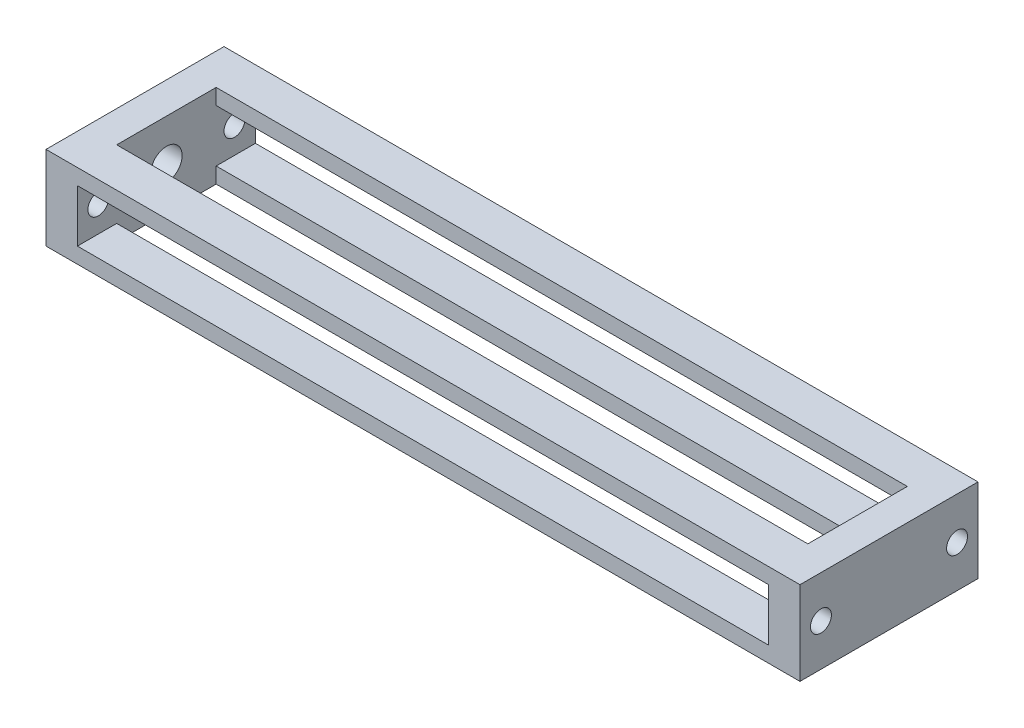
ISO-10303-21;
HEADER;
FILE_DESCRIPTION(('STEP AP214'),'2;1');
FILE_NAME('part.step','',(''),(''),'','','');
FILE_SCHEMA(('AUTOMOTIVE_DESIGN { 1 0 10303 214 1 1 1 1 }'));
ENDSEC;
DATA;
#1=APPLICATION_CONTEXT('core data for automotive mechanical design processes');
#2=APPLICATION_PROTOCOL_DEFINITION('international standard','automotive_design',2000,#1);
#3=PRODUCT_CONTEXT('',#1,'mechanical');
#4=PRODUCT('Part','Part','',(#3));
#5=PRODUCT_RELATED_PRODUCT_CATEGORY('part','',(#4));
#6=PRODUCT_DEFINITION_FORMATION('','',#4);
#7=PRODUCT_DEFINITION_CONTEXT('part definition',#1,'design');
#8=PRODUCT_DEFINITION('design','',#6,#7);
#9=PRODUCT_DEFINITION_SHAPE('','',#8);
#10=(LENGTH_UNIT() NAMED_UNIT(*) SI_UNIT(.MILLI.,.METRE.));
#11=(NAMED_UNIT(*) PLANE_ANGLE_UNIT() SI_UNIT($,.RADIAN.));
#12=(NAMED_UNIT(*) SI_UNIT($,.STERADIAN.) SOLID_ANGLE_UNIT());
#13=UNCERTAINTY_MEASURE_WITH_UNIT(LENGTH_MEASURE(1.E-05),#10,'distance_accuracy_value','');
#14=(GEOMETRIC_REPRESENTATION_CONTEXT(3) GLOBAL_UNCERTAINTY_ASSIGNED_CONTEXT((#13)) GLOBAL_UNIT_ASSIGNED_CONTEXT((#10,
#11,#12)) REPRESENTATION_CONTEXT('',''));
#15=CARTESIAN_POINT('',(0.,0.,0.));
#16=DIRECTION('',(0.,0.,1.));
#17=DIRECTION('',(1.,0.,0.));
#18=AXIS2_PLACEMENT_3D('',#15,#16,#17);
#19=CARTESIAN_POINT('',(-419.1,-0.001000000000001,60.325));
#20=DIRECTION('',(0.,0.,1.));
#21=DIRECTION('',(1.,0.,0.));
#22=AXIS2_PLACEMENT_3D('',#19,#20,#21);
#23=PLANE('',#22);
#24=DIRECTION('',(0.,1.,0.));
#25=VECTOR('',#24,1.);
#26=CARTESIAN_POINT('',(-419.1,-0.001000000000001,60.325));
#27=LINE('',#26,#25);
#28=CARTESIAN_POINT('',(-419.1,0.,60.325));
#29=VERTEX_POINT('',#28);
#30=CARTESIAN_POINT('',(-419.1,19.05,60.325));
#31=VERTEX_POINT('',#30);
#32=EDGE_CURVE('E262',#29,#31,#27,.T.);
#33=ORIENTED_EDGE('',*,*,#32,.T.);
#34=DIRECTION('',(1.,0.,0.));
#35=VECTOR('',#34,1.);
#36=CARTESIAN_POINT('',(-419.1,19.05,60.325));
#37=LINE('',#36,#35);
#38=CARTESIAN_POINT('',(419.1,19.05,60.325));
#39=VERTEX_POINT('',#38);
#40=EDGE_CURVE('E218',#31,#39,#37,.T.);
#41=ORIENTED_EDGE('',*,*,#40,.T.);
#42=DIRECTION('',(0.,1.,0.));
#43=VECTOR('',#42,1.);
#44=CARTESIAN_POINT('',(419.1,-0.001000000000001,60.325));
#45=LINE('',#44,#43);
#46=CARTESIAN_POINT('',(419.1,0.,60.325));
#47=VERTEX_POINT('',#46);
#48=EDGE_CURVE('E256',#47,#39,#45,.T.);
#49=ORIENTED_EDGE('',*,*,#48,.F.);
#50=DIRECTION('',(-1.,0.,0.));
#51=VECTOR('',#50,1.);
#52=CARTESIAN_POINT('',(-419.1,0.,60.325));
#53=LINE('',#52,#51);
#54=EDGE_CURVE('E233',#47,#29,#53,.T.);
#55=ORIENTED_EDGE('',*,*,#54,.T.);
#56=EDGE_LOOP('',(#33,#41,#49,#55));
#57=FACE_BOUND('',#56,.T.);
#58=ADVANCED_FACE('F42',(#57),#23,.F.);
#59=CARTESIAN_POINT('',(-419.1,-0.001000000000001,-60.325));
#60=DIRECTION('',(0.,0.,-1.));
#61=DIRECTION('',(-1.,0.,0.));
#62=AXIS2_PLACEMENT_3D('',#59,#60,#61);
#63=PLANE('',#62);
#64=DIRECTION('',(0.,1.,0.));
#65=VECTOR('',#64,1.);
#66=CARTESIAN_POINT('',(419.1,-0.001000000000001,-60.325));
#67=LINE('',#66,#65);
#68=CARTESIAN_POINT('',(419.1,0.,-60.325));
#69=VERTEX_POINT('',#68);
#70=CARTESIAN_POINT('',(419.1,19.05,-60.325));
#71=VERTEX_POINT('',#70);
#72=EDGE_CURVE('E272',#69,#71,#67,.T.);
#73=ORIENTED_EDGE('',*,*,#72,.T.);
#74=DIRECTION('',(-1.,0.,0.));
#75=VECTOR('',#74,1.);
#76=CARTESIAN_POINT('',(-419.1,19.05,-60.325));
#77=LINE('',#76,#75);
#78=CARTESIAN_POINT('',(-419.1,19.05,-60.325));
#79=VERTEX_POINT('',#78);
#80=EDGE_CURVE('E11',#71,#79,#77,.T.);
#81=ORIENTED_EDGE('',*,*,#80,.T.);
#82=DIRECTION('',(0.,1.,0.));
#83=VECTOR('',#82,1.);
#84=CARTESIAN_POINT('',(-419.1,-0.001000000000001,-60.325));
#85=LINE('',#84,#83);
#86=CARTESIAN_POINT('',(-419.1,0.,-60.325));
#87=VERTEX_POINT('',#86);
#88=EDGE_CURVE('E267',#87,#79,#85,.T.);
#89=ORIENTED_EDGE('',*,*,#88,.F.);
#90=DIRECTION('',(1.,0.,0.));
#91=VECTOR('',#90,1.);
#92=CARTESIAN_POINT('',(-419.1,0.,-60.325));
#93=LINE('',#92,#91);
#94=EDGE_CURVE('E260',#87,#69,#93,.T.);
#95=ORIENTED_EDGE('',*,*,#94,.T.);
#96=EDGE_LOOP('',(#73,#81,#89,#95));
#97=FACE_BOUND('',#96,.T.);
#98=ADVANCED_FACE('F401',(#97),#63,.F.);
#99=CARTESIAN_POINT('',(457.2,101.6,-107.95));
#100=DIRECTION('',(-1.,0.,0.));
#101=DIRECTION('',(0.,0.,1.));
#102=AXIS2_PLACEMENT_3D('',#99,#100,#101);
#103=PLANE('',#102);
#104=CARTESIAN_POINT('',(457.2,50.8,82.5499999999996));
#105=DIRECTION('',(-1.,0.,0.));
#106=DIRECTION('',(0.,0.,1.));
#107=AXIS2_PLACEMENT_3D('',#104,#105,#106);
#108=CIRCLE('',#107,12.7);
#109=CARTESIAN_POINT('',(457.2,50.8,95.2499999999996));
#110=VERTEX_POINT('',#109);
#111=EDGE_CURVE('E326',#110,#110,#108,.T.);
#112=ORIENTED_EDGE('',*,*,#111,.T.);
#113=EDGE_LOOP('',(#112));
#114=FACE_BOUND('',#113,.T.);
#115=CARTESIAN_POINT('',(457.2,50.8,-82.5500000000004));
#116=DIRECTION('',(-1.,0.,0.));
#117=DIRECTION('',(0.,0.,1.));
#118=AXIS2_PLACEMENT_3D('',#115,#116,#117);
#119=CIRCLE('',#118,12.7);
#120=CARTESIAN_POINT('',(457.2,50.8,-69.8500000000004));
#121=VERTEX_POINT('',#120);
#122=EDGE_CURVE('E348',#121,#121,#119,.T.);
#123=ORIENTED_EDGE('',*,*,#122,.T.);
#124=EDGE_LOOP('',(#123));
#125=FACE_BOUND('',#124,.T.);
#126=DIRECTION('',(0.,0.,-1.));
#127=VECTOR('',#126,1.);
#128=CARTESIAN_POINT('',(457.2,0.,-107.95));
#129=LINE('',#128,#127);
#130=CARTESIAN_POINT('',(457.2,0.,107.95));
#131=VERTEX_POINT('',#130);
#132=CARTESIAN_POINT('',(457.2,0.,-107.95));
#133=VERTEX_POINT('',#132);
#134=EDGE_CURVE('E279',#131,#133,#129,.T.);
#135=ORIENTED_EDGE('',*,*,#134,.T.);
#136=DIRECTION('',(0.,-1.,0.));
#137=VECTOR('',#136,1.);
#138=CARTESIAN_POINT('',(457.2,101.6,-107.95));
#139=LINE('',#138,#137);
#140=CARTESIAN_POINT('',(457.2,101.6,-107.95));
#141=VERTEX_POINT('',#140);
#142=EDGE_CURVE('E317',#141,#133,#139,.T.);
#143=ORIENTED_EDGE('',*,*,#142,.F.);
#144=DIRECTION('',(0.,0.,-1.));
#145=VECTOR('',#144,1.);
#146=CARTESIAN_POINT('',(457.2,101.6,-107.95));
#147=LINE('',#146,#145);
#148=CARTESIAN_POINT('',(457.2,101.6,107.95));
#149=VERTEX_POINT('',#148);
#150=EDGE_CURVE('E280',#149,#141,#147,.T.);
#151=ORIENTED_EDGE('',*,*,#150,.F.);
#152=DIRECTION('',(0.,-1.,0.));
#153=VECTOR('',#152,1.);
#154=CARTESIAN_POINT('',(457.2,101.6,107.95));
#155=LINE('',#154,#153);
#156=EDGE_CURVE('E294',#149,#131,#155,.T.);
#157=ORIENTED_EDGE('',*,*,#156,.T.);
#158=EDGE_LOOP('',(#135,#143,#151,#157));
#159=FACE_BOUND('',#158,.T.);
#160=ADVANCED_FACE('F44',(#114,#125,#159),#103,.F.);
#161=CARTESIAN_POINT('',(-457.2,101.6,-107.95));
#162=DIRECTION('',(0.,0.,1.));
#163=DIRECTION('',(1.,0.,0.));
#164=AXIS2_PLACEMENT_3D('',#161,#162,#163);
#165=PLANE('',#164);
#166=DIRECTION('',(1.,0.,0.));
#167=VECTOR('',#166,1.);
#168=CARTESIAN_POINT('',(-419.1,19.05,-107.95));
#169=LINE('',#168,#167);
#170=CARTESIAN_POINT('',(-419.1,19.05,-107.95));
#171=VERTEX_POINT('',#170);
#172=CARTESIAN_POINT('',(419.1,19.05,-107.95));
#173=VERTEX_POINT('',#172);
#174=EDGE_CURVE('E183',#171,#173,#169,.T.);
#175=ORIENTED_EDGE('',*,*,#174,.T.);
#176=DIRECTION('',(0.,1.,0.));
#177=VECTOR('',#176,1.);
#178=CARTESIAN_POINT('',(419.1,82.55,-107.95));
#179=LINE('',#178,#177);
#180=CARTESIAN_POINT('',(419.1,82.55,-107.95));
#181=VERTEX_POINT('',#180);
#182=EDGE_CURVE('E164',#173,#181,#179,.T.);
#183=ORIENTED_EDGE('',*,*,#182,.T.);
#184=DIRECTION('',(-1.,0.,0.));
#185=VECTOR('',#184,1.);
#186=CARTESIAN_POINT('',(-419.1,82.55,-107.95));
#187=LINE('',#186,#185);
#188=CARTESIAN_POINT('',(-419.1,82.55,-107.95));
#189=VERTEX_POINT('',#188);
#190=EDGE_CURVE('E174',#181,#189,#187,.T.);
#191=ORIENTED_EDGE('',*,*,#190,.T.);
#192=DIRECTION('',(0.,-1.,0.));
#193=VECTOR('',#192,1.);
#194=CARTESIAN_POINT('',(-419.1,82.55,-107.95));
#195=LINE('',#194,#193);
#196=EDGE_CURVE('E60',#189,#171,#195,.T.);
#197=ORIENTED_EDGE('',*,*,#196,.T.);
#198=EDGE_LOOP('',(#175,#183,#191,#197));
#199=FACE_BOUND('',#198,.T.);
#200=DIRECTION('',(-1.,0.,0.));
#201=VECTOR('',#200,1.);
#202=CARTESIAN_POINT('',(-457.2,0.,-107.95));
#203=LINE('',#202,#201);
#204=CARTESIAN_POINT('',(-457.2,0.,-107.95));
#205=VERTEX_POINT('',#204);
#206=EDGE_CURVE('E298',#133,#205,#203,.T.);
#207=ORIENTED_EDGE('',*,*,#206,.T.);
#208=DIRECTION('',(0.,-1.,0.));
#209=VECTOR('',#208,1.);
#210=CARTESIAN_POINT('',(-457.2,101.6,-107.95));
#211=LINE('',#210,#209);
#212=CARTESIAN_POINT('',(-457.2,101.6,-107.95));
#213=VERTEX_POINT('',#212);
#214=EDGE_CURVE('E313',#213,#205,#211,.T.);
#215=ORIENTED_EDGE('',*,*,#214,.F.);
#216=DIRECTION('',(-1.,0.,0.));
#217=VECTOR('',#216,1.);
#218=CARTESIAN_POINT('',(-457.2,101.6,-107.95));
#219=LINE('',#218,#217);
#220=EDGE_CURVE('E284',#141,#213,#219,.T.);
#221=ORIENTED_EDGE('',*,*,#220,.F.);
#222=ORIENTED_EDGE('',*,*,#142,.T.);
#223=EDGE_LOOP('',(#207,#215,#221,#222));
#224=FACE_BOUND('',#223,.T.);
#225=ADVANCED_FACE('F180',(#199,#224),#165,.F.);
#226=CARTESIAN_POINT('',(-457.2,101.6,-107.95));
#227=DIRECTION('',(1.,0.,0.));
#228=DIRECTION('',(0.,0.,-1.));
#229=AXIS2_PLACEMENT_3D('',#226,#227,#228);
#230=PLANE('',#229);
#231=CARTESIAN_POINT('',(-457.2,50.8,2.35106052273563E-13));
#232=DIRECTION('',(-1.,0.,0.));
#233=DIRECTION('',(0.,0.,1.));
#234=AXIS2_PLACEMENT_3D('',#231,#232,#233);
#235=CIRCLE('',#234,19.05);
#236=CARTESIAN_POINT('',(-457.2,50.8,19.0500000000002));
#237=VERTEX_POINT('',#236);
#238=EDGE_CURVE('E342',#237,#237,#235,.T.);
#239=ORIENTED_EDGE('',*,*,#238,.F.);
#240=EDGE_LOOP('',(#239));
#241=FACE_BOUND('',#240,.T.);
#242=CARTESIAN_POINT('',(-457.2,50.8,82.55));
#243=DIRECTION('',(-1.,0.,0.));
#244=DIRECTION('',(0.,0.,1.));
#245=AXIS2_PLACEMENT_3D('',#242,#243,#244);
#246=CIRCLE('',#245,12.7);
#247=CARTESIAN_POINT('',(-457.2,50.8,95.25));
#248=VERTEX_POINT('',#247);
#249=EDGE_CURVE('E333',#248,#248,#246,.T.);
#250=ORIENTED_EDGE('',*,*,#249,.F.);
#251=EDGE_LOOP('',(#250));
#252=FACE_BOUND('',#251,.T.);
#253=CARTESIAN_POINT('',(-457.2,50.8,-82.55));
#254=DIRECTION('',(-1.,0.,0.));
#255=DIRECTION('',(0.,0.,1.));
#256=AXIS2_PLACEMENT_3D('',#253,#254,#255);
#257=CIRCLE('',#256,12.7);
#258=CARTESIAN_POINT('',(-457.2,50.8,-69.85));
#259=VERTEX_POINT('',#258);
#260=EDGE_CURVE('E339',#259,#259,#257,.T.);
#261=ORIENTED_EDGE('',*,*,#260,.F.);
#262=EDGE_LOOP('',(#261));
#263=FACE_BOUND('',#262,.T.);
#264=DIRECTION('',(0.,0.,1.));
#265=VECTOR('',#264,1.);
#266=CARTESIAN_POINT('',(-457.2,0.,-107.95));
#267=LINE('',#266,#265);
#268=CARTESIAN_POINT('',(-457.2,0.,107.95));
#269=VERTEX_POINT('',#268);
#270=EDGE_CURVE('E301',#205,#269,#267,.T.);
#271=ORIENTED_EDGE('',*,*,#270,.T.);
#272=DIRECTION('',(0.,-1.,0.));
#273=VECTOR('',#272,1.);
#274=CARTESIAN_POINT('',(-457.2,101.6,107.95));
#275=LINE('',#274,#273);
#276=CARTESIAN_POINT('',(-457.2,101.6,107.95));
#277=VERTEX_POINT('',#276);
#278=EDGE_CURVE('E309',#277,#269,#275,.T.);
#279=ORIENTED_EDGE('',*,*,#278,.F.);
#280=DIRECTION('',(0.,0.,1.));
#281=VECTOR('',#280,1.);
#282=CARTESIAN_POINT('',(-457.2,101.6,-107.95));
#283=LINE('',#282,#281);
#284=EDGE_CURVE('E288',#213,#277,#283,.T.);
#285=ORIENTED_EDGE('',*,*,#284,.F.);
#286=ORIENTED_EDGE('',*,*,#214,.T.);
#287=EDGE_LOOP('',(#271,#279,#285,#286));
#288=FACE_BOUND('',#287,.T.);
#289=ADVANCED_FACE('F446',(#241,#252,#263,#288),#230,.F.);
#290=CARTESIAN_POINT('',(-457.2,101.6,107.95));
#291=DIRECTION('',(0.,0.,-1.));
#292=DIRECTION('',(-1.,0.,0.));
#293=AXIS2_PLACEMENT_3D('',#290,#291,#292);
#294=PLANE('',#293);
#295=DIRECTION('',(1.,0.,0.));
#296=VECTOR('',#295,1.);
#297=CARTESIAN_POINT('',(-457.2,82.55,107.95));
#298=LINE('',#297,#296);
#299=CARTESIAN_POINT('',(-419.1,82.55,107.95));
#300=VERTEX_POINT('',#299);
#301=CARTESIAN_POINT('',(419.1,82.55,107.95));
#302=VERTEX_POINT('',#301);
#303=EDGE_CURVE('E210',#300,#302,#298,.T.);
#304=ORIENTED_EDGE('',*,*,#303,.T.);
#305=DIRECTION('',(0.,-1.,0.));
#306=VECTOR('',#305,1.);
#307=CARTESIAN_POINT('',(419.1,101.6,107.95));
#308=LINE('',#307,#306);
#309=CARTESIAN_POINT('',(419.1,19.05,107.95));
#310=VERTEX_POINT('',#309);
#311=EDGE_CURVE('E226',#302,#310,#308,.T.);
#312=ORIENTED_EDGE('',*,*,#311,.T.);
#313=DIRECTION('',(-1.,0.,0.));
#314=VECTOR('',#313,1.);
#315=CARTESIAN_POINT('',(-457.2,19.05,107.95));
#316=LINE('',#315,#314);
#317=CARTESIAN_POINT('',(-419.1,19.05,107.95));
#318=VERTEX_POINT('',#317);
#319=EDGE_CURVE('E222',#310,#318,#316,.T.);
#320=ORIENTED_EDGE('',*,*,#319,.T.);
#321=DIRECTION('',(0.,1.,0.));
#322=VECTOR('',#321,1.);
#323=CARTESIAN_POINT('',(-419.1,101.6,107.95));
#324=LINE('',#323,#322);
#325=EDGE_CURVE('E214',#318,#300,#324,.T.);
#326=ORIENTED_EDGE('',*,*,#325,.T.);
#327=EDGE_LOOP('',(#304,#312,#320,#326));
#328=FACE_BOUND('',#327,.T.);
#329=DIRECTION('',(1.,0.,0.));
#330=VECTOR('',#329,1.);
#331=CARTESIAN_POINT('',(-457.2,0.,107.95));
#332=LINE('',#331,#330);
#333=EDGE_CURVE('E285',#269,#131,#332,.T.);
#334=ORIENTED_EDGE('',*,*,#333,.T.);
#335=ORIENTED_EDGE('',*,*,#156,.F.);
#336=DIRECTION('',(1.,0.,0.));
#337=VECTOR('',#336,1.);
#338=CARTESIAN_POINT('',(-457.2,101.6,107.95));
#339=LINE('',#338,#337);
#340=EDGE_CURVE('E291',#277,#149,#339,.T.);
#341=ORIENTED_EDGE('',*,*,#340,.F.);
#342=ORIENTED_EDGE('',*,*,#278,.T.);
#343=EDGE_LOOP('',(#334,#335,#341,#342));
#344=FACE_BOUND('',#343,.T.);
#345=ADVANCED_FACE('F391',(#328,#344),#294,.F.);
#346=CARTESIAN_POINT('',(0.,101.6,0.));
#347=DIRECTION('',(0.,1.,0.));
#348=DIRECTION('',(0.,0.,1.));
#349=AXIS2_PLACEMENT_3D('',#346,#347,#348);
#350=PLANE('',#349);
#351=DIRECTION('',(0.,0.,-1.));
#352=VECTOR('',#351,1.);
#353=CARTESIAN_POINT('',(419.1,101.6,-60.325));
#354=LINE('',#353,#352);
#355=CARTESIAN_POINT('',(419.1,101.6,60.325));
#356=VERTEX_POINT('',#355);
#357=CARTESIAN_POINT('',(419.1,101.6,-60.325));
#358=VERTEX_POINT('',#357);
#359=EDGE_CURVE('E241',#356,#358,#354,.T.);
#360=ORIENTED_EDGE('',*,*,#359,.F.);
#361=DIRECTION('',(1.,0.,0.));
#362=VECTOR('',#361,1.);
#363=CARTESIAN_POINT('',(-419.1,101.6,60.325));
#364=LINE('',#363,#362);
#365=CARTESIAN_POINT('',(-419.1,101.6,60.325));
#366=VERTEX_POINT('',#365);
#367=EDGE_CURVE('E252',#366,#356,#364,.T.);
#368=ORIENTED_EDGE('',*,*,#367,.F.);
#369=DIRECTION('',(0.,0.,1.));
#370=VECTOR('',#369,1.);
#371=CARTESIAN_POINT('',(-419.1,101.6,-60.325));
#372=LINE('',#371,#370);
#373=CARTESIAN_POINT('',(-419.1,101.6,-60.325));
#374=VERTEX_POINT('',#373);
#375=EDGE_CURVE('E248',#374,#366,#372,.T.);
#376=ORIENTED_EDGE('',*,*,#375,.F.);
#377=DIRECTION('',(-1.,0.,0.));
#378=VECTOR('',#377,1.);
#379=CARTESIAN_POINT('',(-419.1,101.6,-60.325));
#380=LINE('',#379,#378);
#381=EDGE_CURVE('E244',#358,#374,#380,.T.);
#382=ORIENTED_EDGE('',*,*,#381,.F.);
#383=EDGE_LOOP('',(#360,#368,#376,#382));
#384=FACE_BOUND('',#383,.T.);
#385=ORIENTED_EDGE('',*,*,#150,.T.);
#386=ORIENTED_EDGE('',*,*,#220,.T.);
#387=ORIENTED_EDGE('',*,*,#284,.T.);
#388=ORIENTED_EDGE('',*,*,#340,.T.);
#389=EDGE_LOOP('',(#385,#386,#387,#388));
#390=FACE_BOUND('',#389,.T.);
#391=ADVANCED_FACE('F432',(#384,#390),#350,.T.);
#392=CARTESIAN_POINT('',(0.,0.,0.));
#393=DIRECTION('',(0.,1.,0.));
#394=DIRECTION('',(0.,0.,1.));
#395=AXIS2_PLACEMENT_3D('',#392,#393,#394);
#396=PLANE('',#395);
#397=ORIENTED_EDGE('',*,*,#54,.F.);
#398=DIRECTION('',(0.,0.,1.));
#399=VECTOR('',#398,1.);
#400=CARTESIAN_POINT('',(419.1,0.,-60.325));
#401=LINE('',#400,#399);
#402=EDGE_CURVE('E237',#69,#47,#401,.T.);
#403=ORIENTED_EDGE('',*,*,#402,.F.);
#404=ORIENTED_EDGE('',*,*,#94,.F.);
#405=DIRECTION('',(0.,0.,-1.));
#406=VECTOR('',#405,1.);
#407=CARTESIAN_POINT('',(-419.1,0.,-60.325));
#408=LINE('',#407,#406);
#409=EDGE_CURVE('E230',#29,#87,#408,.T.);
#410=ORIENTED_EDGE('',*,*,#409,.F.);
#411=EDGE_LOOP('',(#397,#403,#404,#410));
#412=FACE_BOUND('',#411,.T.);
#413=ORIENTED_EDGE('',*,*,#134,.F.);
#414=ORIENTED_EDGE('',*,*,#333,.F.);
#415=ORIENTED_EDGE('',*,*,#270,.F.);
#416=ORIENTED_EDGE('',*,*,#206,.F.);
#417=EDGE_LOOP('',(#413,#414,#415,#416));
#418=FACE_BOUND('',#417,.T.);
#419=ADVANCED_FACE('F403',(#412,#418),#396,.F.);
#420=CARTESIAN_POINT('',(419.1,-0.001000000000001,-60.325));
#421=DIRECTION('',(1.,0.,0.));
#422=DIRECTION('',(0.,0.,-1.));
#423=AXIS2_PLACEMENT_3D('',#420,#421,#422);
#424=PLANE('',#423);
#425=CARTESIAN_POINT('',(419.1,50.8,82.5499999999996));
#426=DIRECTION('',(1.,0.,0.));
#427=DIRECTION('',(0.,0.,-1.));
#428=AXIS2_PLACEMENT_3D('',#425,#426,#427);
#429=CIRCLE('',#428,12.7);
#430=CARTESIAN_POINT('',(419.1,50.8,69.8499999999996));
#431=VERTEX_POINT('',#430);
#432=EDGE_CURVE('E185',#431,#431,#429,.T.);
#433=ORIENTED_EDGE('',*,*,#432,.T.);
#434=EDGE_LOOP('',(#433));
#435=FACE_BOUND('',#434,.T.);
#436=CARTESIAN_POINT('',(419.1,50.8,-82.5500000000004));
#437=DIRECTION('',(1.,0.,0.));
#438=DIRECTION('',(0.,0.,-1.));
#439=AXIS2_PLACEMENT_3D('',#436,#437,#438);
#440=CIRCLE('',#439,12.7);
#441=CARTESIAN_POINT('',(419.1,50.8,-95.2500000000004));
#442=VERTEX_POINT('',#441);
#443=EDGE_CURVE('E325',#442,#442,#440,.T.);
#444=ORIENTED_EDGE('',*,*,#443,.T.);
#445=EDGE_LOOP('',(#444));
#446=FACE_BOUND('',#445,.T.);
#447=CARTESIAN_POINT('',(419.1,82.55,-60.325));
#448=VERTEX_POINT('',#447);
#449=EDGE_CURVE('E167',#448,#358,#67,.T.);
#450=ORIENTED_EDGE('',*,*,#449,.F.);
#451=DIRECTION('',(0.,0.,1.));
#452=VECTOR('',#451,1.);
#453=CARTESIAN_POINT('',(419.1,82.55,-107.95));
#454=LINE('',#453,#452);
#455=EDGE_CURVE('E159',#181,#448,#454,.T.);
#456=ORIENTED_EDGE('',*,*,#455,.F.);
#457=ORIENTED_EDGE('',*,*,#182,.F.);
#458=DIRECTION('',(0.,0.,1.));
#459=VECTOR('',#458,1.);
#460=CARTESIAN_POINT('',(419.1,19.05,-107.95));
#461=LINE('',#460,#459);
#462=EDGE_CURVE('E196',#173,#71,#461,.T.);
#463=ORIENTED_EDGE('',*,*,#462,.T.);
#464=ORIENTED_EDGE('',*,*,#72,.F.);
#465=ORIENTED_EDGE('',*,*,#402,.T.);
#466=ORIENTED_EDGE('',*,*,#48,.T.);
#467=EDGE_CURVE('E200',#39,#310,#461,.T.);
#468=ORIENTED_EDGE('',*,*,#467,.T.);
#469=ORIENTED_EDGE('',*,*,#311,.F.);
#470=CARTESIAN_POINT('',(419.1,82.55,60.325));
#471=VERTEX_POINT('',#470);
#472=EDGE_CURVE('E68',#471,#302,#454,.T.);
#473=ORIENTED_EDGE('',*,*,#472,.F.);
#474=EDGE_CURVE('E261',#471,#356,#45,.T.);
#475=ORIENTED_EDGE('',*,*,#474,.T.);
#476=ORIENTED_EDGE('',*,*,#359,.T.);
#477=EDGE_LOOP('',(#450,#456,#457,#463,#464,#465,#466,#468,#469,#473,#475,#476));
#478=FACE_BOUND('',#477,.T.);
#479=ADVANCED_FACE('F161',(#435,#446,#478),#424,.F.);
#480=ORIENTED_EDGE('',*,*,#474,.F.);
#481=DIRECTION('',(-1.,0.,0.));
#482=VECTOR('',#481,1.);
#483=CARTESIAN_POINT('',(-419.1,82.55,60.325));
#484=LINE('',#483,#482);
#485=CARTESIAN_POINT('',(-419.1,82.55,60.325));
#486=VERTEX_POINT('',#485);
#487=EDGE_CURVE('E199',#471,#486,#484,.T.);
#488=ORIENTED_EDGE('',*,*,#487,.T.);
#489=EDGE_CURVE('E266',#486,#366,#27,.T.);
#490=ORIENTED_EDGE('',*,*,#489,.T.);
#491=ORIENTED_EDGE('',*,*,#367,.T.);
#492=EDGE_LOOP('',(#480,#488,#490,#491));
#493=FACE_BOUND('',#492,.T.);
#494=ADVANCED_FACE('F368',(#493),#23,.F.);
#495=CARTESIAN_POINT('',(-419.1,-0.001000000000001,-60.325));
#496=DIRECTION('',(-1.,0.,0.));
#497=DIRECTION('',(0.,0.,1.));
#498=AXIS2_PLACEMENT_3D('',#495,#496,#497);
#499=PLANE('',#498);
#500=CARTESIAN_POINT('',(-419.1,50.8,2.15513881250766E-13));
#501=DIRECTION('',(-1.,0.,0.));
#502=DIRECTION('',(0.,0.,1.));
#503=AXIS2_PLACEMENT_3D('',#500,#501,#502);
#504=CIRCLE('',#503,19.05);
#505=CARTESIAN_POINT('',(-419.1,50.8,19.0500000000002));
#506=VERTEX_POINT('',#505);
#507=EDGE_CURVE('E355',#506,#506,#504,.F.);
#508=ORIENTED_EDGE('',*,*,#507,.F.);
#509=EDGE_LOOP('',(#508));
#510=FACE_BOUND('',#509,.T.);
#511=CARTESIAN_POINT('',(-419.1,50.8,82.55));
#512=DIRECTION('',(-1.,0.,0.));
#513=DIRECTION('',(0.,0.,1.));
#514=AXIS2_PLACEMENT_3D('',#511,#512,#513);
#515=CIRCLE('',#514,12.7);
#516=CARTESIAN_POINT('',(-419.1,50.8,95.25));
#517=VERTEX_POINT('',#516);
#518=EDGE_CURVE('E46',#517,#517,#515,.T.);
#519=ORIENTED_EDGE('',*,*,#518,.T.);
#520=EDGE_LOOP('',(#519));
#521=FACE_BOUND('',#520,.T.);
#522=CARTESIAN_POINT('',(-419.1,50.8,-82.55));
#523=DIRECTION('',(-1.,0.,0.));
#524=DIRECTION('',(0.,0.,1.));
#525=AXIS2_PLACEMENT_3D('',#522,#523,#524);
#526=CIRCLE('',#525,12.7);
#527=CARTESIAN_POINT('',(-419.1,50.8,-69.85));
#528=VERTEX_POINT('',#527);
#529=EDGE_CURVE('E322',#528,#528,#526,.T.);
#530=ORIENTED_EDGE('',*,*,#529,.T.);
#531=EDGE_LOOP('',(#530));
#532=FACE_BOUND('',#531,.T.);
#533=ORIENTED_EDGE('',*,*,#489,.F.);
#534=DIRECTION('',(0.,0.,1.));
#535=VECTOR('',#534,1.);
#536=CARTESIAN_POINT('',(-419.1,82.55,-107.95));
#537=LINE('',#536,#535);
#538=EDGE_CURVE('E171',#486,#300,#537,.T.);
#539=ORIENTED_EDGE('',*,*,#538,.T.);
#540=ORIENTED_EDGE('',*,*,#325,.F.);
#541=DIRECTION('',(0.,0.,1.));
#542=VECTOR('',#541,1.);
#543=CARTESIAN_POINT('',(-419.1,19.05,-107.95));
#544=LINE('',#543,#542);
#545=EDGE_CURVE('E204',#31,#318,#544,.T.);
#546=ORIENTED_EDGE('',*,*,#545,.F.);
#547=ORIENTED_EDGE('',*,*,#32,.F.);
#548=ORIENTED_EDGE('',*,*,#409,.T.);
#549=ORIENTED_EDGE('',*,*,#88,.T.);
#550=EDGE_CURVE('E201',#171,#79,#544,.T.);
#551=ORIENTED_EDGE('',*,*,#550,.F.);
#552=ORIENTED_EDGE('',*,*,#196,.F.);
#553=CARTESIAN_POINT('',(-419.1,82.55,-60.325));
#554=VERTEX_POINT('',#553);
#555=EDGE_CURVE('E176',#189,#554,#537,.T.);
#556=ORIENTED_EDGE('',*,*,#555,.T.);
#557=EDGE_CURVE('E271',#554,#374,#85,.T.);
#558=ORIENTED_EDGE('',*,*,#557,.T.);
#559=ORIENTED_EDGE('',*,*,#375,.T.);
#560=EDGE_LOOP('',(#533,#539,#540,#546,#547,#548,#549,#551,#552,#556,#558,#559));
#561=FACE_BOUND('',#560,.T.);
#562=ADVANCED_FACE('F364',(#510,#521,#532,#561),#499,.F.);
#563=ORIENTED_EDGE('',*,*,#557,.F.);
#564=DIRECTION('',(1.,0.,0.));
#565=VECTOR('',#564,1.);
#566=CARTESIAN_POINT('',(-419.1,82.55,-60.325));
#567=LINE('',#566,#565);
#568=EDGE_CURVE('E52',#554,#448,#567,.T.);
#569=ORIENTED_EDGE('',*,*,#568,.T.);
#570=ORIENTED_EDGE('',*,*,#449,.T.);
#571=ORIENTED_EDGE('',*,*,#381,.T.);
#572=EDGE_LOOP('',(#563,#569,#570,#571));
#573=FACE_BOUND('',#572,.T.);
#574=ADVANCED_FACE('F367',(#573),#63,.F.);
#575=CARTESIAN_POINT('',(-419.1,82.55,-107.95));
#576=DIRECTION('',(0.,1.,0.));
#577=DIRECTION('',(0.,0.,1.));
#578=AXIS2_PLACEMENT_3D('',#575,#576,#577);
#579=PLANE('',#578);
#580=ORIENTED_EDGE('',*,*,#555,.F.);
#581=ORIENTED_EDGE('',*,*,#190,.F.);
#582=ORIENTED_EDGE('',*,*,#455,.T.);
#583=ORIENTED_EDGE('',*,*,#568,.F.);
#584=EDGE_LOOP('',(#580,#581,#582,#583));
#585=FACE_BOUND('',#584,.T.);
#586=ADVANCED_FACE('F175',(#585),#579,.F.);
#587=CARTESIAN_POINT('',(-419.1,19.05,-107.95));
#588=DIRECTION('',(0.,-1.,0.));
#589=DIRECTION('',(0.,0.,-1.));
#590=AXIS2_PLACEMENT_3D('',#587,#588,#589);
#591=PLANE('',#590);
#592=ORIENTED_EDGE('',*,*,#462,.F.);
#593=ORIENTED_EDGE('',*,*,#174,.F.);
#594=ORIENTED_EDGE('',*,*,#550,.T.);
#595=ORIENTED_EDGE('',*,*,#80,.F.);
#596=EDGE_LOOP('',(#592,#593,#594,#595));
#597=FACE_BOUND('',#596,.T.);
#598=ADVANCED_FACE('F406',(#597),#591,.F.);
#599=ORIENTED_EDGE('',*,*,#467,.F.);
#600=ORIENTED_EDGE('',*,*,#40,.F.);
#601=ORIENTED_EDGE('',*,*,#545,.T.);
#602=ORIENTED_EDGE('',*,*,#319,.F.);
#603=EDGE_LOOP('',(#599,#600,#601,#602));
#604=FACE_BOUND('',#603,.T.);
#605=ADVANCED_FACE('F389',(#604),#591,.F.);
#606=ORIENTED_EDGE('',*,*,#538,.F.);
#607=ORIENTED_EDGE('',*,*,#487,.F.);
#608=ORIENTED_EDGE('',*,*,#472,.T.);
#609=ORIENTED_EDGE('',*,*,#303,.F.);
#610=EDGE_LOOP('',(#606,#607,#608,#609));
#611=FACE_BOUND('',#610,.T.);
#612=ADVANCED_FACE('F413',(#611),#579,.F.);
#613=CARTESIAN_POINT('',(457.2,50.8,-82.5500000000004));
#614=DIRECTION('',(-1.,0.,0.));
#615=DIRECTION('',(0.,0.,1.));
#616=AXIS2_PLACEMENT_3D('',#613,#614,#615);
#617=CYLINDRICAL_SURFACE('',#616,12.7);
#618=ORIENTED_EDGE('',*,*,#260,.T.);
#619=EDGE_LOOP('',(#618));
#620=FACE_BOUND('',#619,.T.);
#621=ORIENTED_EDGE('',*,*,#529,.F.);
#622=EDGE_LOOP('',(#621));
#623=FACE_BOUND('',#622,.T.);
#624=ADVANCED_FACE('F530',(#620,#623),#617,.F.);
#625=CARTESIAN_POINT('',(457.2,50.8,82.5499999999996));
#626=DIRECTION('',(-1.,0.,0.));
#627=DIRECTION('',(0.,0.,1.));
#628=AXIS2_PLACEMENT_3D('',#625,#626,#627);
#629=CYLINDRICAL_SURFACE('',#628,12.7);
#630=ORIENTED_EDGE('',*,*,#249,.T.);
#631=EDGE_LOOP('',(#630));
#632=FACE_BOUND('',#631,.T.);
#633=ORIENTED_EDGE('',*,*,#518,.F.);
#634=EDGE_LOOP('',(#633));
#635=FACE_BOUND('',#634,.T.);
#636=ADVANCED_FACE('F540',(#632,#635),#629,.F.);
#637=ORIENTED_EDGE('',*,*,#122,.F.);
#638=EDGE_LOOP('',(#637));
#639=FACE_BOUND('',#638,.T.);
#640=ORIENTED_EDGE('',*,*,#443,.F.);
#641=EDGE_LOOP('',(#640));
#642=FACE_BOUND('',#641,.T.);
#643=ADVANCED_FACE('F542',(#639,#642),#617,.F.);
#644=ORIENTED_EDGE('',*,*,#111,.F.);
#645=EDGE_LOOP('',(#644));
#646=FACE_BOUND('',#645,.T.);
#647=ORIENTED_EDGE('',*,*,#432,.F.);
#648=EDGE_LOOP('',(#647));
#649=FACE_BOUND('',#648,.T.);
#650=ADVANCED_FACE('F549',(#646,#649),#629,.F.);
#651=CARTESIAN_POINT('',(457.201,50.8,-2.35106566503773E-13));
#652=DIRECTION('',(-1.,0.,0.));
#653=DIRECTION('',(0.,0.,1.));
#654=AXIS2_PLACEMENT_3D('',#651,#652,#653);
#655=CYLINDRICAL_SURFACE('',#654,19.05);
#656=ORIENTED_EDGE('',*,*,#238,.T.);
#657=EDGE_LOOP('',(#656));
#658=FACE_BOUND('',#657,.T.);
#659=ORIENTED_EDGE('',*,*,#507,.T.);
#660=EDGE_LOOP('',(#659));
#661=FACE_BOUND('',#660,.T.);
#662=ADVANCED_FACE('F362',(#658,#661),#655,.F.);
#663=CLOSED_SHELL('',(#58,#98,#160,#225,#289,#345,#391,#419,#479,#494,#562,#574,#586,#598,#605,
#612,#624,#636,#643,#650,#662));
#664=MANIFOLD_SOLID_BREP('B2',#663);
#665=ADVANCED_BREP_SHAPE_REPRESENTATION('',(#18,#664),#14);
#666=SHAPE_DEFINITION_REPRESENTATION(#9,#665);
ENDSEC;
END-ISO-10303-21;
